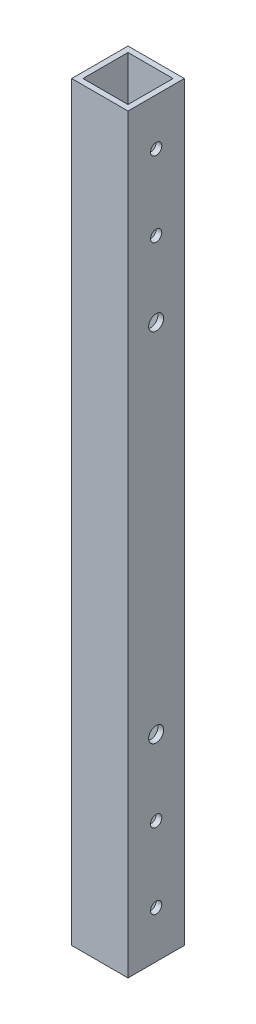
ISO-10303-21;
HEADER;
FILE_DESCRIPTION(('STEP AP214'),'2;1');
FILE_NAME('part.step','',(''),(''),'','','');
FILE_SCHEMA(('AUTOMOTIVE_DESIGN { 1 0 10303 214 1 1 1 1 }'));
ENDSEC;
DATA;
#1=APPLICATION_CONTEXT('core data for automotive mechanical design processes');
#2=APPLICATION_PROTOCOL_DEFINITION('international standard','automotive_design',2000,#1);
#3=PRODUCT_CONTEXT('',#1,'mechanical');
#4=PRODUCT('Part','Part','',(#3));
#5=PRODUCT_RELATED_PRODUCT_CATEGORY('part','',(#4));
#6=PRODUCT_DEFINITION_FORMATION('','',#4);
#7=PRODUCT_DEFINITION_CONTEXT('part definition',#1,'design');
#8=PRODUCT_DEFINITION('design','',#6,#7);
#9=PRODUCT_DEFINITION_SHAPE('','',#8);
#10=(LENGTH_UNIT() NAMED_UNIT(*) SI_UNIT(.MILLI.,.METRE.));
#11=(NAMED_UNIT(*) PLANE_ANGLE_UNIT() SI_UNIT($,.RADIAN.));
#12=(NAMED_UNIT(*) SI_UNIT($,.STERADIAN.) SOLID_ANGLE_UNIT());
#13=UNCERTAINTY_MEASURE_WITH_UNIT(LENGTH_MEASURE(1.E-05),#10,'distance_accuracy_value','');
#14=(GEOMETRIC_REPRESENTATION_CONTEXT(3) GLOBAL_UNCERTAINTY_ASSIGNED_CONTEXT((#13)) GLOBAL_UNIT_ASSIGNED_CONTEXT((#10,
#11,#12)) REPRESENTATION_CONTEXT('',''));
#15=CARTESIAN_POINT('',(0.,0.,0.));
#16=DIRECTION('',(0.,0.,1.));
#17=DIRECTION('',(1.,0.,0.));
#18=AXIS2_PLACEMENT_3D('',#15,#16,#17);
#19=CARTESIAN_POINT('',(0.,200.,0.));
#20=DIRECTION('',(0.,-1.,0.));
#21=DIRECTION('',(0.,0.,-1.));
#22=AXIS2_PLACEMENT_3D('',#19,#20,#21);
#23=PLANE('',#22);
#24=DIRECTION('',(0.,0.,-1.));
#25=VECTOR('',#24,1.);
#26=CARTESIAN_POINT('',(7.5,200.,7.5));
#27=LINE('',#26,#25);
#28=CARTESIAN_POINT('',(7.5,200.,7.5));
#29=VERTEX_POINT('',#28);
#30=CARTESIAN_POINT('',(7.5,200.,-7.5));
#31=VERTEX_POINT('',#30);
#32=EDGE_CURVE('E148',#29,#31,#27,.T.);
#33=ORIENTED_EDGE('',*,*,#32,.T.);
#34=DIRECTION('',(-1.,0.,0.));
#35=VECTOR('',#34,1.);
#36=CARTESIAN_POINT('',(-7.5,200.,-7.5));
#37=LINE('',#36,#35);
#38=CARTESIAN_POINT('',(-7.5,200.,-7.5));
#39=VERTEX_POINT('',#38);
#40=EDGE_CURVE('E151',#31,#39,#37,.T.);
#41=ORIENTED_EDGE('',*,*,#40,.T.);
#42=DIRECTION('',(0.,0.,1.));
#43=VECTOR('',#42,1.);
#44=CARTESIAN_POINT('',(-7.5,200.,7.5));
#45=LINE('',#44,#43);
#46=CARTESIAN_POINT('',(-7.5,200.,7.5));
#47=VERTEX_POINT('',#46);
#48=EDGE_CURVE('E154',#39,#47,#45,.T.);
#49=ORIENTED_EDGE('',*,*,#48,.T.);
#50=DIRECTION('',(1.,0.,0.));
#51=VECTOR('',#50,1.);
#52=CARTESIAN_POINT('',(-7.5,200.,7.5));
#53=LINE('',#52,#51);
#54=EDGE_CURVE('E156',#47,#29,#53,.T.);
#55=ORIENTED_EDGE('',*,*,#54,.T.);
#56=EDGE_LOOP('',(#33,#41,#49,#55));
#57=FACE_BOUND('',#56,.T.);
#58=DIRECTION('',(0.,0.,-1.));
#59=VECTOR('',#58,1.);
#60=CARTESIAN_POINT('',(6.,200.,6.));
#61=LINE('',#60,#59);
#62=CARTESIAN_POINT('',(6.,200.,6.));
#63=VERTEX_POINT('',#62);
#64=CARTESIAN_POINT('',(6.,200.,-6.));
#65=VERTEX_POINT('',#64);
#66=EDGE_CURVE('E110',#63,#65,#61,.T.);
#67=ORIENTED_EDGE('',*,*,#66,.F.);
#68=DIRECTION('',(1.,0.,0.));
#69=VECTOR('',#68,1.);
#70=CARTESIAN_POINT('',(-6.,200.,6.));
#71=LINE('',#70,#69);
#72=CARTESIAN_POINT('',(-6.,200.,6.));
#73=VERTEX_POINT('',#72);
#74=EDGE_CURVE('E132',#73,#63,#71,.T.);
#75=ORIENTED_EDGE('',*,*,#74,.F.);
#76=DIRECTION('',(0.,0.,1.));
#77=VECTOR('',#76,1.);
#78=CARTESIAN_POINT('',(-6.,200.,6.));
#79=LINE('',#78,#77);
#80=CARTESIAN_POINT('',(-6.,200.,-6.));
#81=VERTEX_POINT('',#80);
#82=EDGE_CURVE('E130',#81,#73,#79,.T.);
#83=ORIENTED_EDGE('',*,*,#82,.F.);
#84=DIRECTION('',(-1.,0.,0.));
#85=VECTOR('',#84,1.);
#86=CARTESIAN_POINT('',(-6.,200.,-6.));
#87=LINE('',#86,#85);
#88=EDGE_CURVE('E118',#65,#81,#87,.T.);
#89=ORIENTED_EDGE('',*,*,#88,.F.);
#90=EDGE_LOOP('',(#67,#75,#83,#89));
#91=FACE_BOUND('',#90,.T.);
#92=ADVANCED_FACE('F43',(#57,#91),#23,.F.);
#93=CARTESIAN_POINT('',(0.,0.,0.));
#94=DIRECTION('',(0.,-1.,0.));
#95=DIRECTION('',(0.,0.,-1.));
#96=AXIS2_PLACEMENT_3D('',#93,#94,#95);
#97=PLANE('',#96);
#98=DIRECTION('',(0.,0.,-1.));
#99=VECTOR('',#98,1.);
#100=CARTESIAN_POINT('',(7.5,0.,7.5));
#101=LINE('',#100,#99);
#102=CARTESIAN_POINT('',(7.5,0.,7.5));
#103=VERTEX_POINT('',#102);
#104=CARTESIAN_POINT('',(7.5,0.,-7.5));
#105=VERTEX_POINT('',#104);
#106=EDGE_CURVE('E126',#103,#105,#101,.T.);
#107=ORIENTED_EDGE('',*,*,#106,.F.);
#108=DIRECTION('',(1.,0.,0.));
#109=VECTOR('',#108,1.);
#110=CARTESIAN_POINT('',(-7.5,0.,7.5));
#111=LINE('',#110,#109);
#112=CARTESIAN_POINT('',(-7.5,0.,7.5));
#113=VERTEX_POINT('',#112);
#114=EDGE_CURVE('E152',#113,#103,#111,.T.);
#115=ORIENTED_EDGE('',*,*,#114,.F.);
#116=DIRECTION('',(0.,0.,1.));
#117=VECTOR('',#116,1.);
#118=CARTESIAN_POINT('',(-7.5,0.,7.5));
#119=LINE('',#118,#117);
#120=CARTESIAN_POINT('',(-7.5,0.,-7.5));
#121=VERTEX_POINT('',#120);
#122=EDGE_CURVE('E163',#121,#113,#119,.T.);
#123=ORIENTED_EDGE('',*,*,#122,.F.);
#124=DIRECTION('',(-1.,0.,0.));
#125=VECTOR('',#124,1.);
#126=CARTESIAN_POINT('',(-7.5,0.,-7.5));
#127=LINE('',#126,#125);
#128=EDGE_CURVE('E161',#105,#121,#127,.T.);
#129=ORIENTED_EDGE('',*,*,#128,.F.);
#130=EDGE_LOOP('',(#107,#115,#123,#129));
#131=FACE_BOUND('',#130,.T.);
#132=DIRECTION('',(1.,0.,0.));
#133=VECTOR('',#132,1.);
#134=CARTESIAN_POINT('',(-6.,0.,6.));
#135=LINE('',#134,#133);
#136=CARTESIAN_POINT('',(-6.,0.,6.));
#137=VERTEX_POINT('',#136);
#138=CARTESIAN_POINT('',(6.,0.,6.));
#139=VERTEX_POINT('',#138);
#140=EDGE_CURVE('E119',#137,#139,#135,.T.);
#141=ORIENTED_EDGE('',*,*,#140,.T.);
#142=DIRECTION('',(0.,0.,-1.));
#143=VECTOR('',#142,1.);
#144=CARTESIAN_POINT('',(6.,0.,6.));
#145=LINE('',#144,#143);
#146=CARTESIAN_POINT('',(6.,0.,-6.));
#147=VERTEX_POINT('',#146);
#148=EDGE_CURVE('E68',#139,#147,#145,.T.);
#149=ORIENTED_EDGE('',*,*,#148,.T.);
#150=DIRECTION('',(-1.,0.,0.));
#151=VECTOR('',#150,1.);
#152=CARTESIAN_POINT('',(-6.,0.,-6.));
#153=LINE('',#152,#151);
#154=CARTESIAN_POINT('',(-6.,0.,-6.));
#155=VERTEX_POINT('',#154);
#156=EDGE_CURVE('E125',#147,#155,#153,.T.);
#157=ORIENTED_EDGE('',*,*,#156,.T.);
#158=DIRECTION('',(0.,0.,1.));
#159=VECTOR('',#158,1.);
#160=CARTESIAN_POINT('',(-6.,0.,6.));
#161=LINE('',#160,#159);
#162=EDGE_CURVE('E140',#155,#137,#161,.T.);
#163=ORIENTED_EDGE('',*,*,#162,.T.);
#164=EDGE_LOOP('',(#141,#149,#157,#163));
#165=FACE_BOUND('',#164,.T.);
#166=ADVANCED_FACE('F227',(#131,#165),#97,.T.);
#167=CARTESIAN_POINT('',(7.5,200.,7.5));
#168=DIRECTION('',(-1.,0.,0.));
#169=DIRECTION('',(0.,0.,1.));
#170=AXIS2_PLACEMENT_3D('',#167,#168,#169);
#171=PLANE('',#170);
#172=CARTESIAN_POINT('',(7.5,187.500000000002,0.));
#173=DIRECTION('',(-1.,0.,0.));
#174=DIRECTION('',(0.,0.,1.));
#175=AXIS2_PLACEMENT_3D('',#172,#173,#174);
#176=CIRCLE('',#175,1.50000000000225);
#177=CARTESIAN_POINT('',(7.5,187.500000000002,1.50000000000234));
#178=VERTEX_POINT('',#177);
#179=EDGE_CURVE('E177',#178,#178,#176,.T.);
#180=ORIENTED_EDGE('',*,*,#179,.T.);
#181=EDGE_LOOP('',(#180));
#182=FACE_BOUND('',#181,.T.);
#183=CARTESIAN_POINT('',(7.5,167.500000000002,0.));
#184=DIRECTION('',(-1.,0.,0.));
#185=DIRECTION('',(0.,0.,1.));
#186=AXIS2_PLACEMENT_3D('',#183,#184,#185);
#187=CIRCLE('',#186,1.50000000000226);
#188=CARTESIAN_POINT('',(7.5,167.500000000002,1.50000000000235));
#189=VERTEX_POINT('',#188);
#190=EDGE_CURVE('E284',#189,#189,#187,.T.);
#191=ORIENTED_EDGE('',*,*,#190,.T.);
#192=EDGE_LOOP('',(#191));
#193=FACE_BOUND('',#192,.T.);
#194=CARTESIAN_POINT('',(7.5,147.5,0.));
#195=DIRECTION('',(-1.,0.,0.));
#196=DIRECTION('',(0.,0.,1.));
#197=AXIS2_PLACEMENT_3D('',#194,#195,#196);
#198=CIRCLE('',#197,2.);
#199=CARTESIAN_POINT('',(7.5,147.5,2.00000000000009));
#200=VERTEX_POINT('',#199);
#201=EDGE_CURVE('E288',#200,#200,#198,.T.);
#202=ORIENTED_EDGE('',*,*,#201,.T.);
#203=EDGE_LOOP('',(#202));
#204=FACE_BOUND('',#203,.T.);
#205=CARTESIAN_POINT('',(7.5,52.4999999999999,0.));
#206=DIRECTION('',(-1.,0.,0.));
#207=DIRECTION('',(0.,0.,1.));
#208=AXIS2_PLACEMENT_3D('',#205,#206,#207);
#209=CIRCLE('',#208,2.);
#210=CARTESIAN_POINT('',(7.5,52.4999999999999,2.00000000000009));
#211=VERTEX_POINT('',#210);
#212=EDGE_CURVE('E292',#211,#211,#209,.T.);
#213=ORIENTED_EDGE('',*,*,#212,.T.);
#214=EDGE_LOOP('',(#213));
#215=FACE_BOUND('',#214,.T.);
#216=CARTESIAN_POINT('',(7.5,32.5000000000018,3.45279360658423E-13));
#217=DIRECTION('',(-1.,0.,0.));
#218=DIRECTION('',(0.,0.,1.));
#219=AXIS2_PLACEMENT_3D('',#216,#217,#218);
#220=CIRCLE('',#219,1.5);
#221=CARTESIAN_POINT('',(7.5,32.5000000000018,1.50000000000035));
#222=VERTEX_POINT('',#221);
#223=EDGE_CURVE('E296',#222,#222,#220,.T.);
#224=ORIENTED_EDGE('',*,*,#223,.T.);
#225=EDGE_LOOP('',(#224));
#226=FACE_BOUND('',#225,.T.);
#227=CARTESIAN_POINT('',(7.5,12.5000000000018,1.31006316905768E-13));
#228=DIRECTION('',(-1.,0.,0.));
#229=DIRECTION('',(0.,0.,1.));
#230=AXIS2_PLACEMENT_3D('',#227,#228,#229);
#231=CIRCLE('',#230,1.5);
#232=CARTESIAN_POINT('',(7.5,12.5000000000018,1.50000000000013));
#233=VERTEX_POINT('',#232);
#234=EDGE_CURVE('E299',#233,#233,#231,.T.);
#235=ORIENTED_EDGE('',*,*,#234,.T.);
#236=EDGE_LOOP('',(#235));
#237=FACE_BOUND('',#236,.T.);
#238=ORIENTED_EDGE('',*,*,#106,.T.);
#239=DIRECTION('',(0.,-1.,0.));
#240=VECTOR('',#239,1.);
#241=CARTESIAN_POINT('',(7.5,200.,-7.5));
#242=LINE('',#241,#240);
#243=EDGE_CURVE('E11',#31,#105,#242,.T.);
#244=ORIENTED_EDGE('',*,*,#243,.F.);
#245=ORIENTED_EDGE('',*,*,#32,.F.);
#246=DIRECTION('',(0.,-1.,0.));
#247=VECTOR('',#246,1.);
#248=CARTESIAN_POINT('',(7.5,200.,7.5));
#249=LINE('',#248,#247);
#250=EDGE_CURVE('E158',#29,#103,#249,.T.);
#251=ORIENTED_EDGE('',*,*,#250,.T.);
#252=EDGE_LOOP('',(#238,#244,#245,#251));
#253=FACE_BOUND('',#252,.T.);
#254=ADVANCED_FACE('F45',(#182,#193,#204,#215,#226,#237,#253),#171,.F.);
#255=CARTESIAN_POINT('',(-7.5,200.,-7.5));
#256=DIRECTION('',(0.,0.,1.));
#257=DIRECTION('',(1.,0.,0.));
#258=AXIS2_PLACEMENT_3D('',#255,#256,#257);
#259=PLANE('',#258);
#260=ORIENTED_EDGE('',*,*,#128,.T.);
#261=DIRECTION('',(0.,-1.,0.));
#262=VECTOR('',#261,1.);
#263=CARTESIAN_POINT('',(-7.5,200.,-7.5));
#264=LINE('',#263,#262);
#265=EDGE_CURVE('E52',#39,#121,#264,.T.);
#266=ORIENTED_EDGE('',*,*,#265,.F.);
#267=ORIENTED_EDGE('',*,*,#40,.F.);
#268=ORIENTED_EDGE('',*,*,#243,.T.);
#269=EDGE_LOOP('',(#260,#266,#267,#268));
#270=FACE_BOUND('',#269,.T.);
#271=ADVANCED_FACE('F257',(#270),#259,.F.);
#272=CARTESIAN_POINT('',(-7.5,200.,7.5));
#273=DIRECTION('',(1.,0.,0.));
#274=DIRECTION('',(0.,0.,-1.));
#275=AXIS2_PLACEMENT_3D('',#272,#273,#274);
#276=PLANE('',#275);
#277=CARTESIAN_POINT('',(-7.5,187.500000000002,0.));
#278=DIRECTION('',(-1.,0.,0.));
#279=DIRECTION('',(0.,0.,1.));
#280=AXIS2_PLACEMENT_3D('',#277,#278,#279);
#281=CIRCLE('',#280,1.50000000000225);
#282=CARTESIAN_POINT('',(-7.5,187.500000000002,1.50000000000234));
#283=VERTEX_POINT('',#282);
#284=EDGE_CURVE('E358',#283,#283,#281,.T.);
#285=ORIENTED_EDGE('',*,*,#284,.F.);
#286=EDGE_LOOP('',(#285));
#287=FACE_BOUND('',#286,.T.);
#288=CARTESIAN_POINT('',(-7.5,167.500000000002,0.));
#289=DIRECTION('',(-1.,0.,0.));
#290=DIRECTION('',(0.,0.,1.));
#291=AXIS2_PLACEMENT_3D('',#288,#289,#290);
#292=CIRCLE('',#291,1.50000000000226);
#293=CARTESIAN_POINT('',(-7.5,167.500000000002,1.50000000000235));
#294=VERTEX_POINT('',#293);
#295=EDGE_CURVE('E354',#294,#294,#292,.T.);
#296=ORIENTED_EDGE('',*,*,#295,.F.);
#297=EDGE_LOOP('',(#296));
#298=FACE_BOUND('',#297,.T.);
#299=CARTESIAN_POINT('',(-7.5,147.5,0.));
#300=DIRECTION('',(-1.,0.,0.));
#301=DIRECTION('',(0.,0.,1.));
#302=AXIS2_PLACEMENT_3D('',#299,#300,#301);
#303=CIRCLE('',#302,2.);
#304=CARTESIAN_POINT('',(-7.5,147.5,2.00000000000009));
#305=VERTEX_POINT('',#304);
#306=EDGE_CURVE('E355',#305,#305,#303,.T.);
#307=ORIENTED_EDGE('',*,*,#306,.F.);
#308=EDGE_LOOP('',(#307));
#309=FACE_BOUND('',#308,.T.);
#310=CARTESIAN_POINT('',(-7.5,52.4999999999999,0.));
#311=DIRECTION('',(-1.,0.,0.));
#312=DIRECTION('',(0.,0.,1.));
#313=AXIS2_PLACEMENT_3D('',#310,#311,#312);
#314=CIRCLE('',#313,2.);
#315=CARTESIAN_POINT('',(-7.5,52.4999999999999,2.00000000000009));
#316=VERTEX_POINT('',#315);
#317=EDGE_CURVE('E365',#316,#316,#314,.T.);
#318=ORIENTED_EDGE('',*,*,#317,.F.);
#319=EDGE_LOOP('',(#318));
#320=FACE_BOUND('',#319,.T.);
#321=CARTESIAN_POINT('',(-7.5,32.5000000000018,3.45279360658423E-13));
#322=DIRECTION('',(-1.,0.,0.));
#323=DIRECTION('',(0.,0.,1.));
#324=AXIS2_PLACEMENT_3D('',#321,#322,#323);
#325=CIRCLE('',#324,1.5);
#326=CARTESIAN_POINT('',(-7.5,32.5000000000018,1.50000000000035));
#327=VERTEX_POINT('',#326);
#328=EDGE_CURVE('E369',#327,#327,#325,.T.);
#329=ORIENTED_EDGE('',*,*,#328,.F.);
#330=EDGE_LOOP('',(#329));
#331=FACE_BOUND('',#330,.T.);
#332=CARTESIAN_POINT('',(-7.5,12.5000000000018,1.31006316905768E-13));
#333=DIRECTION('',(-1.,0.,0.));
#334=DIRECTION('',(0.,0.,1.));
#335=AXIS2_PLACEMENT_3D('',#332,#333,#334);
#336=CIRCLE('',#335,1.5);
#337=CARTESIAN_POINT('',(-7.5,12.5000000000018,1.50000000000013));
#338=VERTEX_POINT('',#337);
#339=EDGE_CURVE('E301',#338,#338,#336,.T.);
#340=ORIENTED_EDGE('',*,*,#339,.F.);
#341=EDGE_LOOP('',(#340));
#342=FACE_BOUND('',#341,.T.);
#343=ORIENTED_EDGE('',*,*,#122,.T.);
#344=DIRECTION('',(0.,-1.,0.));
#345=VECTOR('',#344,1.);
#346=CARTESIAN_POINT('',(-7.5,200.,7.5));
#347=LINE('',#346,#345);
#348=EDGE_CURVE('E168',#47,#113,#347,.T.);
#349=ORIENTED_EDGE('',*,*,#348,.F.);
#350=ORIENTED_EDGE('',*,*,#48,.F.);
#351=ORIENTED_EDGE('',*,*,#265,.T.);
#352=EDGE_LOOP('',(#343,#349,#350,#351));
#353=FACE_BOUND('',#352,.T.);
#354=ADVANCED_FACE('F254',(#287,#298,#309,#320,#331,#342,#353),#276,.F.);
#355=CARTESIAN_POINT('',(-7.5,200.,7.5));
#356=DIRECTION('',(0.,0.,-1.));
#357=DIRECTION('',(-1.,0.,0.));
#358=AXIS2_PLACEMENT_3D('',#355,#356,#357);
#359=PLANE('',#358);
#360=ORIENTED_EDGE('',*,*,#114,.T.);
#361=ORIENTED_EDGE('',*,*,#250,.F.);
#362=ORIENTED_EDGE('',*,*,#54,.F.);
#363=ORIENTED_EDGE('',*,*,#348,.T.);
#364=EDGE_LOOP('',(#360,#361,#362,#363));
#365=FACE_BOUND('',#364,.T.);
#366=ADVANCED_FACE('F251',(#365),#359,.F.);
#367=CARTESIAN_POINT('',(6.,200.,6.));
#368=DIRECTION('',(-1.,0.,0.));
#369=DIRECTION('',(0.,0.,1.));
#370=AXIS2_PLACEMENT_3D('',#367,#368,#369);
#371=PLANE('',#370);
#372=CARTESIAN_POINT('',(6.,187.500000000002,0.));
#373=DIRECTION('',(-1.,0.,0.));
#374=DIRECTION('',(0.,0.,1.));
#375=AXIS2_PLACEMENT_3D('',#372,#373,#374);
#376=CIRCLE('',#375,1.50000000000225);
#377=CARTESIAN_POINT('',(6.,187.500000000002,1.50000000000234));
#378=VERTEX_POINT('',#377);
#379=EDGE_CURVE('E138',#378,#378,#376,.T.);
#380=ORIENTED_EDGE('',*,*,#379,.F.);
#381=EDGE_LOOP('',(#380));
#382=FACE_BOUND('',#381,.T.);
#383=CARTESIAN_POINT('',(6.,167.500000000002,0.));
#384=DIRECTION('',(-1.,0.,0.));
#385=DIRECTION('',(0.,0.,1.));
#386=AXIS2_PLACEMENT_3D('',#383,#384,#385);
#387=CIRCLE('',#386,1.50000000000226);
#388=CARTESIAN_POINT('',(6.,167.500000000002,1.50000000000235));
#389=VERTEX_POINT('',#388);
#390=EDGE_CURVE('E191',#389,#389,#387,.T.);
#391=ORIENTED_EDGE('',*,*,#390,.F.);
#392=EDGE_LOOP('',(#391));
#393=FACE_BOUND('',#392,.T.);
#394=CARTESIAN_POINT('',(6.,147.5,0.));
#395=DIRECTION('',(-1.,0.,0.));
#396=DIRECTION('',(0.,0.,1.));
#397=AXIS2_PLACEMENT_3D('',#394,#395,#396);
#398=CIRCLE('',#397,2.);
#399=CARTESIAN_POINT('',(6.,147.5,2.00000000000009));
#400=VERTEX_POINT('',#399);
#401=EDGE_CURVE('E188',#400,#400,#398,.T.);
#402=ORIENTED_EDGE('',*,*,#401,.F.);
#403=EDGE_LOOP('',(#402));
#404=FACE_BOUND('',#403,.T.);
#405=CARTESIAN_POINT('',(6.,52.4999999999999,0.));
#406=DIRECTION('',(-1.,0.,0.));
#407=DIRECTION('',(0.,0.,1.));
#408=AXIS2_PLACEMENT_3D('',#405,#406,#407);
#409=CIRCLE('',#408,2.);
#410=CARTESIAN_POINT('',(6.,52.4999999999999,2.00000000000009));
#411=VERTEX_POINT('',#410);
#412=EDGE_CURVE('E185',#411,#411,#409,.T.);
#413=ORIENTED_EDGE('',*,*,#412,.F.);
#414=EDGE_LOOP('',(#413));
#415=FACE_BOUND('',#414,.T.);
#416=CARTESIAN_POINT('',(6.,32.5000000000018,3.45279360658423E-13));
#417=DIRECTION('',(-1.,0.,0.));
#418=DIRECTION('',(0.,0.,1.));
#419=AXIS2_PLACEMENT_3D('',#416,#417,#418);
#420=CIRCLE('',#419,1.5);
#421=CARTESIAN_POINT('',(6.,32.5000000000018,1.50000000000035));
#422=VERTEX_POINT('',#421);
#423=EDGE_CURVE('E181',#422,#422,#420,.T.);
#424=ORIENTED_EDGE('',*,*,#423,.F.);
#425=EDGE_LOOP('',(#424));
#426=FACE_BOUND('',#425,.T.);
#427=CARTESIAN_POINT('',(6.,12.5000000000018,1.31006316905768E-13));
#428=DIRECTION('',(-1.,0.,0.));
#429=DIRECTION('',(0.,0.,1.));
#430=AXIS2_PLACEMENT_3D('',#427,#428,#429);
#431=CIRCLE('',#430,1.5);
#432=CARTESIAN_POINT('',(6.,12.5000000000018,1.50000000000013));
#433=VERTEX_POINT('',#432);
#434=EDGE_CURVE('E176',#433,#433,#431,.T.);
#435=ORIENTED_EDGE('',*,*,#434,.F.);
#436=EDGE_LOOP('',(#435));
#437=FACE_BOUND('',#436,.T.);
#438=ORIENTED_EDGE('',*,*,#148,.F.);
#439=DIRECTION('',(0.,-1.,0.));
#440=VECTOR('',#439,1.);
#441=CARTESIAN_POINT('',(6.,200.,6.));
#442=LINE('',#441,#440);
#443=EDGE_CURVE('E114',#63,#139,#442,.T.);
#444=ORIENTED_EDGE('',*,*,#443,.F.);
#445=ORIENTED_EDGE('',*,*,#66,.T.);
#446=DIRECTION('',(0.,-1.,0.));
#447=VECTOR('',#446,1.);
#448=CARTESIAN_POINT('',(6.,200.,-6.));
#449=LINE('',#448,#447);
#450=EDGE_CURVE('E113',#65,#147,#449,.T.);
#451=ORIENTED_EDGE('',*,*,#450,.T.);
#452=EDGE_LOOP('',(#438,#444,#445,#451));
#453=FACE_BOUND('',#452,.T.);
#454=ADVANCED_FACE('F112',(#382,#393,#404,#415,#426,#437,#453),#371,.T.);
#455=CARTESIAN_POINT('',(-6.,200.,-6.));
#456=DIRECTION('',(0.,0.,1.));
#457=DIRECTION('',(1.,0.,0.));
#458=AXIS2_PLACEMENT_3D('',#455,#456,#457);
#459=PLANE('',#458);
#460=ORIENTED_EDGE('',*,*,#156,.F.);
#461=ORIENTED_EDGE('',*,*,#450,.F.);
#462=ORIENTED_EDGE('',*,*,#88,.T.);
#463=DIRECTION('',(0.,-1.,0.));
#464=VECTOR('',#463,1.);
#465=CARTESIAN_POINT('',(-6.,200.,-6.));
#466=LINE('',#465,#464);
#467=EDGE_CURVE('E127',#81,#155,#466,.T.);
#468=ORIENTED_EDGE('',*,*,#467,.T.);
#469=EDGE_LOOP('',(#460,#461,#462,#468));
#470=FACE_BOUND('',#469,.T.);
#471=ADVANCED_FACE('F122',(#470),#459,.T.);
#472=CARTESIAN_POINT('',(-6.,200.,6.));
#473=DIRECTION('',(1.,0.,0.));
#474=DIRECTION('',(0.,0.,-1.));
#475=AXIS2_PLACEMENT_3D('',#472,#473,#474);
#476=PLANE('',#475);
#477=CARTESIAN_POINT('',(-6.,187.500000000002,0.));
#478=DIRECTION('',(1.,0.,0.));
#479=DIRECTION('',(0.,0.,-1.));
#480=AXIS2_PLACEMENT_3D('',#477,#478,#479);
#481=CIRCLE('',#480,1.50000000000225);
#482=CARTESIAN_POINT('',(-6.,187.500000000002,-1.50000000000217));
#483=VERTEX_POINT('',#482);
#484=EDGE_CURVE('E47',#483,#483,#481,.T.);
#485=ORIENTED_EDGE('',*,*,#484,.F.);
#486=EDGE_LOOP('',(#485));
#487=FACE_BOUND('',#486,.T.);
#488=CARTESIAN_POINT('',(-6.,167.500000000002,0.));
#489=DIRECTION('',(1.,0.,0.));
#490=DIRECTION('',(0.,0.,-1.));
#491=AXIS2_PLACEMENT_3D('',#488,#489,#490);
#492=CIRCLE('',#491,1.50000000000226);
#493=CARTESIAN_POINT('',(-6.,167.500000000002,-1.50000000000218));
#494=VERTEX_POINT('',#493);
#495=EDGE_CURVE('E189',#494,#494,#492,.T.);
#496=ORIENTED_EDGE('',*,*,#495,.F.);
#497=EDGE_LOOP('',(#496));
#498=FACE_BOUND('',#497,.T.);
#499=CARTESIAN_POINT('',(-6.,147.5,0.));
#500=DIRECTION('',(1.,0.,0.));
#501=DIRECTION('',(0.,0.,-1.));
#502=AXIS2_PLACEMENT_3D('',#499,#500,#501);
#503=CIRCLE('',#502,2.);
#504=CARTESIAN_POINT('',(-6.,147.5,-1.99999999999992));
#505=VERTEX_POINT('',#504);
#506=EDGE_CURVE('E186',#505,#505,#503,.T.);
#507=ORIENTED_EDGE('',*,*,#506,.F.);
#508=EDGE_LOOP('',(#507));
#509=FACE_BOUND('',#508,.T.);
#510=CARTESIAN_POINT('',(-6.,52.4999999999999,0.));
#511=DIRECTION('',(1.,0.,0.));
#512=DIRECTION('',(0.,0.,-1.));
#513=AXIS2_PLACEMENT_3D('',#510,#511,#512);
#514=CIRCLE('',#513,2.);
#515=CARTESIAN_POINT('',(-6.,52.4999999999999,-1.99999999999992));
#516=VERTEX_POINT('',#515);
#517=EDGE_CURVE('E182',#516,#516,#514,.T.);
#518=ORIENTED_EDGE('',*,*,#517,.F.);
#519=EDGE_LOOP('',(#518));
#520=FACE_BOUND('',#519,.T.);
#521=CARTESIAN_POINT('',(-6.,32.5000000000018,3.45279360658423E-13));
#522=DIRECTION('',(1.,0.,0.));
#523=DIRECTION('',(0.,0.,-1.));
#524=AXIS2_PLACEMENT_3D('',#521,#522,#523);
#525=CIRCLE('',#524,1.5);
#526=CARTESIAN_POINT('',(-6.,32.5000000000018,-1.49999999999966));
#527=VERTEX_POINT('',#526);
#528=EDGE_CURVE('E178',#527,#527,#525,.T.);
#529=ORIENTED_EDGE('',*,*,#528,.F.);
#530=EDGE_LOOP('',(#529));
#531=FACE_BOUND('',#530,.T.);
#532=CARTESIAN_POINT('',(-6.,12.5000000000018,1.31006316905768E-13));
#533=DIRECTION('',(1.,0.,0.));
#534=DIRECTION('',(0.,0.,-1.));
#535=AXIS2_PLACEMENT_3D('',#532,#533,#534);
#536=CIRCLE('',#535,1.5);
#537=CARTESIAN_POINT('',(-6.,12.5000000000018,-1.49999999999987));
#538=VERTEX_POINT('',#537);
#539=EDGE_CURVE('E173',#538,#538,#536,.T.);
#540=ORIENTED_EDGE('',*,*,#539,.F.);
#541=EDGE_LOOP('',(#540));
#542=FACE_BOUND('',#541,.T.);
#543=ORIENTED_EDGE('',*,*,#162,.F.);
#544=ORIENTED_EDGE('',*,*,#467,.F.);
#545=ORIENTED_EDGE('',*,*,#82,.T.);
#546=DIRECTION('',(0.,-1.,0.));
#547=VECTOR('',#546,1.);
#548=CARTESIAN_POINT('',(-6.,200.,6.));
#549=LINE('',#548,#547);
#550=EDGE_CURVE('E60',#73,#137,#549,.T.);
#551=ORIENTED_EDGE('',*,*,#550,.T.);
#552=EDGE_LOOP('',(#543,#544,#545,#551));
#553=FACE_BOUND('',#552,.T.);
#554=ADVANCED_FACE('F211',(#487,#498,#509,#520,#531,#542,#553),#476,.T.);
#555=CARTESIAN_POINT('',(-6.,200.,6.));
#556=DIRECTION('',(0.,0.,-1.));
#557=DIRECTION('',(-1.,0.,0.));
#558=AXIS2_PLACEMENT_3D('',#555,#556,#557);
#559=PLANE('',#558);
#560=ORIENTED_EDGE('',*,*,#140,.F.);
#561=ORIENTED_EDGE('',*,*,#550,.F.);
#562=ORIENTED_EDGE('',*,*,#74,.T.);
#563=ORIENTED_EDGE('',*,*,#443,.T.);
#564=EDGE_LOOP('',(#560,#561,#562,#563));
#565=FACE_BOUND('',#564,.T.);
#566=ADVANCED_FACE('F214',(#565),#559,.T.);
#567=CARTESIAN_POINT('',(7.5,12.5000000000018,1.31006316905768E-13));
#568=DIRECTION('',(-1.,0.,0.));
#569=DIRECTION('',(0.,0.,1.));
#570=AXIS2_PLACEMENT_3D('',#567,#568,#569);
#571=CYLINDRICAL_SURFACE('',#570,1.5);
#572=ORIENTED_EDGE('',*,*,#539,.T.);
#573=EDGE_LOOP('',(#572));
#574=FACE_BOUND('',#573,.T.);
#575=ORIENTED_EDGE('',*,*,#339,.T.);
#576=EDGE_LOOP('',(#575));
#577=FACE_BOUND('',#576,.T.);
#578=ADVANCED_FACE('F229',(#574,#577),#571,.F.);
#579=CARTESIAN_POINT('',(7.5,32.5000000000018,3.45279360658423E-13));
#580=DIRECTION('',(-1.,0.,0.));
#581=DIRECTION('',(0.,0.,1.));
#582=AXIS2_PLACEMENT_3D('',#579,#580,#581);
#583=CYLINDRICAL_SURFACE('',#582,1.5);
#584=ORIENTED_EDGE('',*,*,#528,.T.);
#585=EDGE_LOOP('',(#584));
#586=FACE_BOUND('',#585,.T.);
#587=ORIENTED_EDGE('',*,*,#328,.T.);
#588=EDGE_LOOP('',(#587));
#589=FACE_BOUND('',#588,.T.);
#590=ADVANCED_FACE('F236',(#586,#589),#583,.F.);
#591=CARTESIAN_POINT('',(7.5,52.4999999999999,0.));
#592=DIRECTION('',(-1.,0.,0.));
#593=DIRECTION('',(0.,0.,1.));
#594=AXIS2_PLACEMENT_3D('',#591,#592,#593);
#595=CYLINDRICAL_SURFACE('',#594,2.);
#596=ORIENTED_EDGE('',*,*,#517,.T.);
#597=EDGE_LOOP('',(#596));
#598=FACE_BOUND('',#597,.T.);
#599=ORIENTED_EDGE('',*,*,#317,.T.);
#600=EDGE_LOOP('',(#599));
#601=FACE_BOUND('',#600,.T.);
#602=ADVANCED_FACE('F331',(#598,#601),#595,.F.);
#603=CARTESIAN_POINT('',(7.5,147.5,0.));
#604=DIRECTION('',(-1.,0.,0.));
#605=DIRECTION('',(0.,0.,1.));
#606=AXIS2_PLACEMENT_3D('',#603,#604,#605);
#607=CYLINDRICAL_SURFACE('',#606,2.);
#608=ORIENTED_EDGE('',*,*,#506,.T.);
#609=EDGE_LOOP('',(#608));
#610=FACE_BOUND('',#609,.T.);
#611=ORIENTED_EDGE('',*,*,#306,.T.);
#612=EDGE_LOOP('',(#611));
#613=FACE_BOUND('',#612,.T.);
#614=ADVANCED_FACE('F335',(#610,#613),#607,.F.);
#615=CARTESIAN_POINT('',(7.5,167.500000000002,0.));
#616=DIRECTION('',(-1.,0.,0.));
#617=DIRECTION('',(0.,0.,1.));
#618=AXIS2_PLACEMENT_3D('',#615,#616,#617);
#619=CYLINDRICAL_SURFACE('',#618,1.50000000000226);
#620=ORIENTED_EDGE('',*,*,#495,.T.);
#621=EDGE_LOOP('',(#620));
#622=FACE_BOUND('',#621,.T.);
#623=ORIENTED_EDGE('',*,*,#295,.T.);
#624=EDGE_LOOP('',(#623));
#625=FACE_BOUND('',#624,.T.);
#626=ADVANCED_FACE('F326',(#622,#625),#619,.F.);
#627=CARTESIAN_POINT('',(7.5,187.500000000002,0.));
#628=DIRECTION('',(-1.,0.,0.));
#629=DIRECTION('',(0.,0.,1.));
#630=AXIS2_PLACEMENT_3D('',#627,#628,#629);
#631=CYLINDRICAL_SURFACE('',#630,1.50000000000225);
#632=ORIENTED_EDGE('',*,*,#484,.T.);
#633=EDGE_LOOP('',(#632));
#634=FACE_BOUND('',#633,.T.);
#635=ORIENTED_EDGE('',*,*,#284,.T.);
#636=EDGE_LOOP('',(#635));
#637=FACE_BOUND('',#636,.T.);
#638=ADVANCED_FACE('F208',(#634,#637),#631,.F.);
#639=ORIENTED_EDGE('',*,*,#434,.T.);
#640=EDGE_LOOP('',(#639));
#641=FACE_BOUND('',#640,.T.);
#642=ORIENTED_EDGE('',*,*,#234,.F.);
#643=EDGE_LOOP('',(#642));
#644=FACE_BOUND('',#643,.T.);
#645=ADVANCED_FACE('F239',(#641,#644),#571,.F.);
#646=ORIENTED_EDGE('',*,*,#423,.T.);
#647=EDGE_LOOP('',(#646));
#648=FACE_BOUND('',#647,.T.);
#649=ORIENTED_EDGE('',*,*,#223,.F.);
#650=EDGE_LOOP('',(#649));
#651=FACE_BOUND('',#650,.T.);
#652=ADVANCED_FACE('F311',(#648,#651),#583,.F.);
#653=ORIENTED_EDGE('',*,*,#412,.T.);
#654=EDGE_LOOP('',(#653));
#655=FACE_BOUND('',#654,.T.);
#656=ORIENTED_EDGE('',*,*,#212,.F.);
#657=EDGE_LOOP('',(#656));
#658=FACE_BOUND('',#657,.T.);
#659=ADVANCED_FACE('F324',(#655,#658),#595,.F.);
#660=ORIENTED_EDGE('',*,*,#401,.T.);
#661=EDGE_LOOP('',(#660));
#662=FACE_BOUND('',#661,.T.);
#663=ORIENTED_EDGE('',*,*,#201,.F.);
#664=EDGE_LOOP('',(#663));
#665=FACE_BOUND('',#664,.T.);
#666=ADVANCED_FACE('F340',(#662,#665),#607,.F.);
#667=ORIENTED_EDGE('',*,*,#390,.T.);
#668=EDGE_LOOP('',(#667));
#669=FACE_BOUND('',#668,.T.);
#670=ORIENTED_EDGE('',*,*,#190,.F.);
#671=EDGE_LOOP('',(#670));
#672=FACE_BOUND('',#671,.T.);
#673=ADVANCED_FACE('F342',(#669,#672),#619,.F.);
#674=ORIENTED_EDGE('',*,*,#379,.T.);
#675=EDGE_LOOP('',(#674));
#676=FACE_BOUND('',#675,.T.);
#677=ORIENTED_EDGE('',*,*,#179,.F.);
#678=EDGE_LOOP('',(#677));
#679=FACE_BOUND('',#678,.T.);
#680=ADVANCED_FACE('F328',(#676,#679),#631,.F.);
#681=CLOSED_SHELL('',(#92,#166,#254,#271,#354,#366,#454,#471,#554,#566,#578,#590,#602,#614,#626,
#638,#645,#652,#659,#666,#673,#680));
#682=MANIFOLD_SOLID_BREP('B2',#681);
#683=ADVANCED_BREP_SHAPE_REPRESENTATION('',(#18,#682),#14);
#684=SHAPE_DEFINITION_REPRESENTATION(#9,#683);
ENDSEC;
END-ISO-10303-21;
